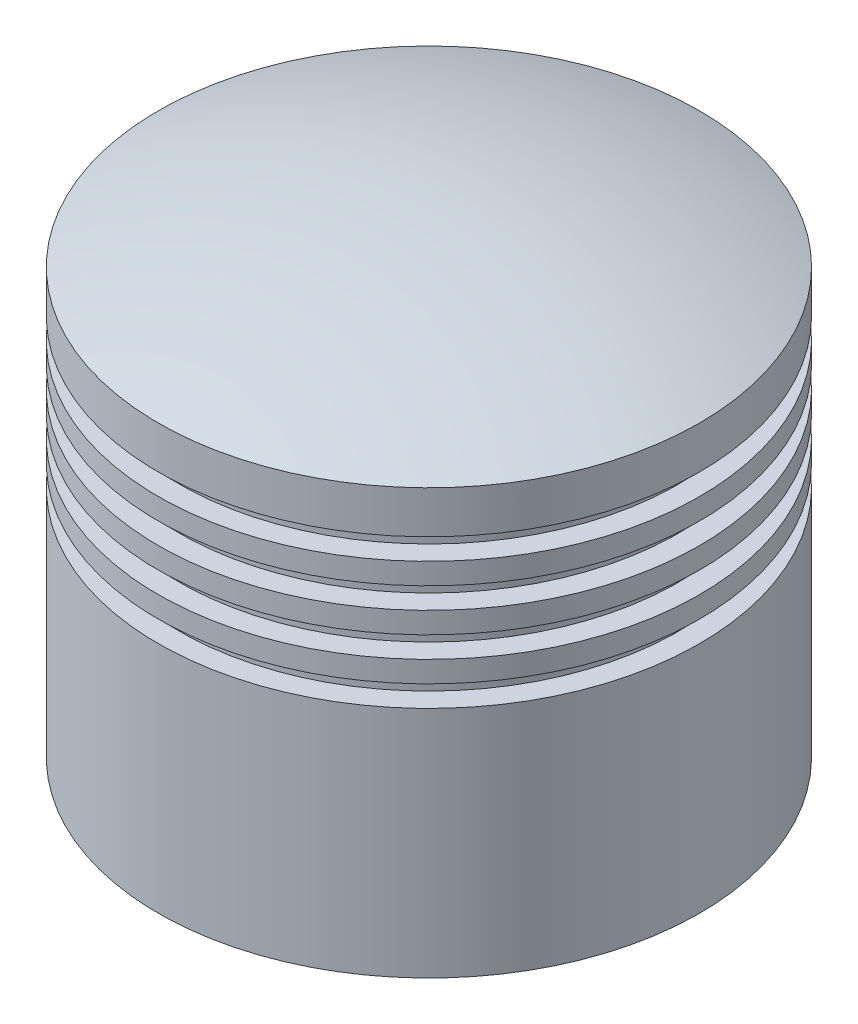
ISO-10303-21;
HEADER;
FILE_DESCRIPTION(('STEP AP214'),'2;1');
FILE_NAME('part.step','',(''),(''),'','','');
FILE_SCHEMA(('AUTOMOTIVE_DESIGN { 1 0 10303 214 1 1 1 1 }'));
ENDSEC;
DATA;
#1=APPLICATION_CONTEXT('core data for automotive mechanical design processes');
#2=APPLICATION_PROTOCOL_DEFINITION('international standard','automotive_design',2000,#1);
#3=PRODUCT_CONTEXT('',#1,'mechanical');
#4=PRODUCT('Part','Part','',(#3));
#5=PRODUCT_RELATED_PRODUCT_CATEGORY('part','',(#4));
#6=PRODUCT_DEFINITION_FORMATION('','',#4);
#7=PRODUCT_DEFINITION_CONTEXT('part definition',#1,'design');
#8=PRODUCT_DEFINITION('design','',#6,#7);
#9=PRODUCT_DEFINITION_SHAPE('','',#8);
#10=(LENGTH_UNIT() NAMED_UNIT(*) SI_UNIT(.MILLI.,.METRE.));
#11=(NAMED_UNIT(*) PLANE_ANGLE_UNIT() SI_UNIT($,.RADIAN.));
#12=(NAMED_UNIT(*) SI_UNIT($,.STERADIAN.) SOLID_ANGLE_UNIT());
#13=UNCERTAINTY_MEASURE_WITH_UNIT(LENGTH_MEASURE(1.E-05),#10,'distance_accuracy_value','');
#14=(GEOMETRIC_REPRESENTATION_CONTEXT(3) GLOBAL_UNCERTAINTY_ASSIGNED_CONTEXT((#13)) GLOBAL_UNIT_ASSIGNED_CONTEXT((#10,
#11,#12)) REPRESENTATION_CONTEXT('',''));
#15=CARTESIAN_POINT('',(0.,0.,0.));
#16=DIRECTION('',(0.,0.,1.));
#17=DIRECTION('',(1.,0.,0.));
#18=AXIS2_PLACEMENT_3D('',#15,#16,#17);
#19=CARTESIAN_POINT('',(63.7222756739561,0.,0.));
#20=DIRECTION('',(0.,-1.,0.));
#21=DIRECTION('',(0.,0.,-1.));
#22=AXIS2_PLACEMENT_3D('',#19,#20,#21);
#23=PLANE('',#22);
#24=CARTESIAN_POINT('',(0.,0.,0.));
#25=DIRECTION('',(0.,-1.,0.));
#26=DIRECTION('',(0.,0.,-1.));
#27=AXIS2_PLACEMENT_3D('',#24,#25,#26);
#28=CIRCLE('',#27,63.7222756739561);
#29=CARTESIAN_POINT('',(0.,0.,-63.7222756739561));
#30=VERTEX_POINT('',#29);
#31=EDGE_CURVE('E10',#30,#30,#28,.T.);
#32=ORIENTED_EDGE('',*,*,#31,.T.);
#33=EDGE_LOOP('',(#32));
#34=FACE_BOUND('',#33,.T.);
#35=CARTESIAN_POINT('',(0.,0.,0.));
#36=DIRECTION('',(0.,-1.,0.));
#37=DIRECTION('',(0.,0.,-1.));
#38=AXIS2_PLACEMENT_3D('',#35,#36,#37);
#39=CIRCLE('',#38,50.);
#40=CARTESIAN_POINT('',(0.,0.,-50.));
#41=VERTEX_POINT('',#40);
#42=EDGE_CURVE('E105',#41,#41,#39,.T.);
#43=ORIENTED_EDGE('',*,*,#42,.F.);
#44=EDGE_LOOP('',(#43));
#45=FACE_BOUND('',#44,.T.);
#46=ADVANCED_FACE('F35',(#34,#45),#23,.T.);
#47=CARTESIAN_POINT('',(0.,0.,0.));
#48=DIRECTION('',(0.,-1.,0.));
#49=DIRECTION('',(0.,0.,-1.));
#50=AXIS2_PLACEMENT_3D('',#47,#48,#49);
#51=CYLINDRICAL_SURFACE('',#50,63.7222756739561);
#52=CARTESIAN_POINT('',(0.,55.,0.));
#53=DIRECTION('',(0.,-1.,0.));
#54=DIRECTION('',(0.,0.,-1.));
#55=AXIS2_PLACEMENT_3D('',#52,#53,#54);
#56=CIRCLE('',#55,63.7222756739561);
#57=CARTESIAN_POINT('',(0.,55.,-63.7222756739561));
#58=VERTEX_POINT('',#57);
#59=EDGE_CURVE('E41',#58,#58,#56,.T.);
#60=ORIENTED_EDGE('',*,*,#59,.T.);
#61=EDGE_LOOP('',(#60));
#62=FACE_BOUND('',#61,.T.);
#63=ORIENTED_EDGE('',*,*,#31,.F.);
#64=EDGE_LOOP('',(#63));
#65=FACE_BOUND('',#64,.T.);
#66=ADVANCED_FACE('F113',(#62,#65),#51,.T.);
#67=CARTESIAN_POINT('',(63.7222756739561,55.,0.));
#68=DIRECTION('',(0.,1.,0.));
#69=DIRECTION('',(0.,0.,1.));
#70=AXIS2_PLACEMENT_3D('',#67,#68,#69);
#71=PLANE('',#70);
#72=CARTESIAN_POINT('',(0.,55.,0.));
#73=DIRECTION('',(0.,-1.,0.));
#74=DIRECTION('',(0.,0.,-1.));
#75=AXIS2_PLACEMENT_3D('',#72,#73,#74);
#76=CIRCLE('',#75,58.7222756739561);
#77=CARTESIAN_POINT('',(0.,55.,-58.7222756739561));
#78=VERTEX_POINT('',#77);
#79=EDGE_CURVE('E45',#78,#78,#76,.T.);
#80=ORIENTED_EDGE('',*,*,#79,.T.);
#81=EDGE_LOOP('',(#80));
#82=FACE_BOUND('',#81,.T.);
#83=ORIENTED_EDGE('',*,*,#59,.F.);
#84=EDGE_LOOP('',(#83));
#85=FACE_BOUND('',#84,.T.);
#86=ADVANCED_FACE('F117',(#82,#85),#71,.T.);
#87=CARTESIAN_POINT('',(0.,0.,0.));
#88=DIRECTION('',(0.,-1.,0.));
#89=DIRECTION('',(0.,0.,-1.));
#90=AXIS2_PLACEMENT_3D('',#87,#88,#89);
#91=CYLINDRICAL_SURFACE('',#90,58.7222756739561);
#92=CARTESIAN_POINT('',(0.,60.,0.));
#93=DIRECTION('',(0.,-1.,0.));
#94=DIRECTION('',(0.,0.,-1.));
#95=AXIS2_PLACEMENT_3D('',#92,#93,#94);
#96=CIRCLE('',#95,58.7222756739561);
#97=CARTESIAN_POINT('',(0.,60.,-58.7222756739561));
#98=VERTEX_POINT('',#97);
#99=EDGE_CURVE('E49',#98,#98,#96,.T.);
#100=ORIENTED_EDGE('',*,*,#99,.T.);
#101=EDGE_LOOP('',(#100));
#102=FACE_BOUND('',#101,.T.);
#103=ORIENTED_EDGE('',*,*,#79,.F.);
#104=EDGE_LOOP('',(#103));
#105=FACE_BOUND('',#104,.T.);
#106=ADVANCED_FACE('F121',(#102,#105),#91,.T.);
#107=CARTESIAN_POINT('',(58.7222756739561,60.,0.));
#108=DIRECTION('',(0.,-1.,0.));
#109=DIRECTION('',(0.,0.,-1.));
#110=AXIS2_PLACEMENT_3D('',#107,#108,#109);
#111=PLANE('',#110);
#112=CARTESIAN_POINT('',(0.,60.,0.));
#113=DIRECTION('',(0.,-1.,0.));
#114=DIRECTION('',(0.,0.,-1.));
#115=AXIS2_PLACEMENT_3D('',#112,#113,#114);
#116=CIRCLE('',#115,63.7222756739561);
#117=CARTESIAN_POINT('',(0.,60.,-63.7222756739561));
#118=VERTEX_POINT('',#117);
#119=EDGE_CURVE('E54',#118,#118,#116,.T.);
#120=ORIENTED_EDGE('',*,*,#119,.T.);
#121=EDGE_LOOP('',(#120));
#122=FACE_BOUND('',#121,.T.);
#123=ORIENTED_EDGE('',*,*,#99,.F.);
#124=EDGE_LOOP('',(#123));
#125=FACE_BOUND('',#124,.T.);
#126=ADVANCED_FACE('F128',(#122,#125),#111,.T.);
#127=CARTESIAN_POINT('',(0.,0.,0.));
#128=DIRECTION('',(0.,-1.,0.));
#129=DIRECTION('',(0.,0.,-1.));
#130=AXIS2_PLACEMENT_3D('',#127,#128,#129);
#131=CYLINDRICAL_SURFACE('',#130,63.7222756739561);
#132=CARTESIAN_POINT('',(0.,65.,0.));
#133=DIRECTION('',(0.,-1.,0.));
#134=DIRECTION('',(0.,0.,-1.));
#135=AXIS2_PLACEMENT_3D('',#132,#133,#134);
#136=CIRCLE('',#135,63.7222756739561);
#137=CARTESIAN_POINT('',(0.,65.,-63.7222756739561));
#138=VERTEX_POINT('',#137);
#139=EDGE_CURVE('E57',#138,#138,#136,.T.);
#140=ORIENTED_EDGE('',*,*,#139,.T.);
#141=EDGE_LOOP('',(#140));
#142=FACE_BOUND('',#141,.T.);
#143=ORIENTED_EDGE('',*,*,#119,.F.);
#144=EDGE_LOOP('',(#143));
#145=FACE_BOUND('',#144,.T.);
#146=ADVANCED_FACE('F132',(#142,#145),#131,.T.);
#147=CARTESIAN_POINT('',(63.7222756739561,65.,0.));
#148=DIRECTION('',(0.,1.,0.));
#149=DIRECTION('',(0.,0.,1.));
#150=AXIS2_PLACEMENT_3D('',#147,#148,#149);
#151=PLANE('',#150);
#152=CARTESIAN_POINT('',(0.,65.,0.));
#153=DIRECTION('',(0.,-1.,0.));
#154=DIRECTION('',(0.,0.,-1.));
#155=AXIS2_PLACEMENT_3D('',#152,#153,#154);
#156=CIRCLE('',#155,58.7222756739561);
#157=CARTESIAN_POINT('',(0.,65.,-58.7222756739561));
#158=VERTEX_POINT('',#157);
#159=EDGE_CURVE('E60',#158,#158,#156,.T.);
#160=ORIENTED_EDGE('',*,*,#159,.T.);
#161=EDGE_LOOP('',(#160));
#162=FACE_BOUND('',#161,.T.);
#163=ORIENTED_EDGE('',*,*,#139,.F.);
#164=EDGE_LOOP('',(#163));
#165=FACE_BOUND('',#164,.T.);
#166=ADVANCED_FACE('F136',(#162,#165),#151,.T.);
#167=CARTESIAN_POINT('',(0.,0.,0.));
#168=DIRECTION('',(0.,-1.,0.));
#169=DIRECTION('',(0.,0.,-1.));
#170=AXIS2_PLACEMENT_3D('',#167,#168,#169);
#171=CYLINDRICAL_SURFACE('',#170,58.7222756739561);
#172=CARTESIAN_POINT('',(0.,70.,0.));
#173=DIRECTION('',(0.,-1.,0.));
#174=DIRECTION('',(0.,0.,-1.));
#175=AXIS2_PLACEMENT_3D('',#172,#173,#174);
#176=CIRCLE('',#175,58.7222756739561);
#177=CARTESIAN_POINT('',(0.,70.,-58.7222756739561));
#178=VERTEX_POINT('',#177);
#179=EDGE_CURVE('E63',#178,#178,#176,.T.);
#180=ORIENTED_EDGE('',*,*,#179,.T.);
#181=EDGE_LOOP('',(#180));
#182=FACE_BOUND('',#181,.T.);
#183=ORIENTED_EDGE('',*,*,#159,.F.);
#184=EDGE_LOOP('',(#183));
#185=FACE_BOUND('',#184,.T.);
#186=ADVANCED_FACE('F140',(#182,#185),#171,.T.);
#187=CARTESIAN_POINT('',(58.7222756739561,70.,0.));
#188=DIRECTION('',(0.,-1.,0.));
#189=DIRECTION('',(0.,0.,-1.));
#190=AXIS2_PLACEMENT_3D('',#187,#188,#189);
#191=PLANE('',#190);
#192=CARTESIAN_POINT('',(0.,70.,0.));
#193=DIRECTION('',(0.,-1.,0.));
#194=DIRECTION('',(0.,0.,-1.));
#195=AXIS2_PLACEMENT_3D('',#192,#193,#194);
#196=CIRCLE('',#195,63.7222756739561);
#197=CARTESIAN_POINT('',(0.,70.,-63.7222756739561));
#198=VERTEX_POINT('',#197);
#199=EDGE_CURVE('E66',#198,#198,#196,.T.);
#200=ORIENTED_EDGE('',*,*,#199,.T.);
#201=EDGE_LOOP('',(#200));
#202=FACE_BOUND('',#201,.T.);
#203=ORIENTED_EDGE('',*,*,#179,.F.);
#204=EDGE_LOOP('',(#203));
#205=FACE_BOUND('',#204,.T.);
#206=ADVANCED_FACE('F144',(#202,#205),#191,.T.);
#207=CARTESIAN_POINT('',(0.,0.,0.));
#208=DIRECTION('',(0.,-1.,0.));
#209=DIRECTION('',(0.,0.,-1.));
#210=AXIS2_PLACEMENT_3D('',#207,#208,#209);
#211=CYLINDRICAL_SURFACE('',#210,63.7222756739561);
#212=CARTESIAN_POINT('',(0.,75.,0.));
#213=DIRECTION('',(0.,-1.,0.));
#214=DIRECTION('',(0.,0.,-1.));
#215=AXIS2_PLACEMENT_3D('',#212,#213,#214);
#216=CIRCLE('',#215,63.7222756739561);
#217=CARTESIAN_POINT('',(0.,75.,-63.7222756739561));
#218=VERTEX_POINT('',#217);
#219=EDGE_CURVE('E69',#218,#218,#216,.T.);
#220=ORIENTED_EDGE('',*,*,#219,.T.);
#221=EDGE_LOOP('',(#220));
#222=FACE_BOUND('',#221,.T.);
#223=ORIENTED_EDGE('',*,*,#199,.F.);
#224=EDGE_LOOP('',(#223));
#225=FACE_BOUND('',#224,.T.);
#226=ADVANCED_FACE('F148',(#222,#225),#211,.T.);
#227=CARTESIAN_POINT('',(63.7222756739561,75.,0.));
#228=DIRECTION('',(0.,1.,0.));
#229=DIRECTION('',(0.,0.,1.));
#230=AXIS2_PLACEMENT_3D('',#227,#228,#229);
#231=PLANE('',#230);
#232=CARTESIAN_POINT('',(0.,75.,0.));
#233=DIRECTION('',(0.,-1.,0.));
#234=DIRECTION('',(0.,0.,-1.));
#235=AXIS2_PLACEMENT_3D('',#232,#233,#234);
#236=CIRCLE('',#235,58.7222756739561);
#237=CARTESIAN_POINT('',(0.,75.,-58.7222756739561));
#238=VERTEX_POINT('',#237);
#239=EDGE_CURVE('E72',#238,#238,#236,.T.);
#240=ORIENTED_EDGE('',*,*,#239,.T.);
#241=EDGE_LOOP('',(#240));
#242=FACE_BOUND('',#241,.T.);
#243=ORIENTED_EDGE('',*,*,#219,.F.);
#244=EDGE_LOOP('',(#243));
#245=FACE_BOUND('',#244,.T.);
#246=ADVANCED_FACE('F152',(#242,#245),#231,.T.);
#247=CARTESIAN_POINT('',(0.,0.,0.));
#248=DIRECTION('',(0.,-1.,0.));
#249=DIRECTION('',(0.,0.,-1.));
#250=AXIS2_PLACEMENT_3D('',#247,#248,#249);
#251=CYLINDRICAL_SURFACE('',#250,58.7222756739561);
#252=CARTESIAN_POINT('',(0.,80.,0.));
#253=DIRECTION('',(0.,-1.,0.));
#254=DIRECTION('',(0.,0.,-1.));
#255=AXIS2_PLACEMENT_3D('',#252,#253,#254);
#256=CIRCLE('',#255,58.7222756739561);
#257=CARTESIAN_POINT('',(0.,80.,-58.7222756739561));
#258=VERTEX_POINT('',#257);
#259=EDGE_CURVE('E75',#258,#258,#256,.T.);
#260=ORIENTED_EDGE('',*,*,#259,.T.);
#261=EDGE_LOOP('',(#260));
#262=FACE_BOUND('',#261,.T.);
#263=ORIENTED_EDGE('',*,*,#239,.F.);
#264=EDGE_LOOP('',(#263));
#265=FACE_BOUND('',#264,.T.);
#266=ADVANCED_FACE('F156',(#262,#265),#251,.T.);
#267=CARTESIAN_POINT('',(58.7222756739561,80.,0.));
#268=DIRECTION('',(0.,-1.,0.));
#269=DIRECTION('',(0.,0.,-1.));
#270=AXIS2_PLACEMENT_3D('',#267,#268,#269);
#271=PLANE('',#270);
#272=CARTESIAN_POINT('',(0.,80.,0.));
#273=DIRECTION('',(0.,-1.,0.));
#274=DIRECTION('',(0.,0.,-1.));
#275=AXIS2_PLACEMENT_3D('',#272,#273,#274);
#276=CIRCLE('',#275,63.7222756739561);
#277=CARTESIAN_POINT('',(0.,80.,-63.7222756739561));
#278=VERTEX_POINT('',#277);
#279=EDGE_CURVE('E78',#278,#278,#276,.T.);
#280=ORIENTED_EDGE('',*,*,#279,.T.);
#281=EDGE_LOOP('',(#280));
#282=FACE_BOUND('',#281,.T.);
#283=ORIENTED_EDGE('',*,*,#259,.F.);
#284=EDGE_LOOP('',(#283));
#285=FACE_BOUND('',#284,.T.);
#286=ADVANCED_FACE('F160',(#282,#285),#271,.T.);
#287=CARTESIAN_POINT('',(0.,0.,0.));
#288=DIRECTION('',(0.,-1.,0.));
#289=DIRECTION('',(0.,0.,-1.));
#290=AXIS2_PLACEMENT_3D('',#287,#288,#289);
#291=CYLINDRICAL_SURFACE('',#290,63.7222756739561);
#292=CARTESIAN_POINT('',(0.,85.,0.));
#293=DIRECTION('',(0.,-1.,0.));
#294=DIRECTION('',(0.,0.,-1.));
#295=AXIS2_PLACEMENT_3D('',#292,#293,#294);
#296=CIRCLE('',#295,63.7222756739561);
#297=CARTESIAN_POINT('',(0.,85.,-63.7222756739561));
#298=VERTEX_POINT('',#297);
#299=EDGE_CURVE('E81',#298,#298,#296,.T.);
#300=ORIENTED_EDGE('',*,*,#299,.T.);
#301=EDGE_LOOP('',(#300));
#302=FACE_BOUND('',#301,.T.);
#303=ORIENTED_EDGE('',*,*,#279,.F.);
#304=EDGE_LOOP('',(#303));
#305=FACE_BOUND('',#304,.T.);
#306=ADVANCED_FACE('F164',(#302,#305),#291,.T.);
#307=CARTESIAN_POINT('',(63.7222756739561,85.,0.));
#308=DIRECTION('',(0.,1.,0.));
#309=DIRECTION('',(0.,0.,1.));
#310=AXIS2_PLACEMENT_3D('',#307,#308,#309);
#311=PLANE('',#310);
#312=CARTESIAN_POINT('',(0.,85.,0.));
#313=DIRECTION('',(0.,-1.,0.));
#314=DIRECTION('',(0.,0.,-1.));
#315=AXIS2_PLACEMENT_3D('',#312,#313,#314);
#316=CIRCLE('',#315,58.7222756739561);
#317=CARTESIAN_POINT('',(0.,85.,-58.7222756739561));
#318=VERTEX_POINT('',#317);
#319=EDGE_CURVE('E84',#318,#318,#316,.T.);
#320=ORIENTED_EDGE('',*,*,#319,.T.);
#321=EDGE_LOOP('',(#320));
#322=FACE_BOUND('',#321,.T.);
#323=ORIENTED_EDGE('',*,*,#299,.F.);
#324=EDGE_LOOP('',(#323));
#325=FACE_BOUND('',#324,.T.);
#326=ADVANCED_FACE('F168',(#322,#325),#311,.T.);
#327=CARTESIAN_POINT('',(0.,0.,0.));
#328=DIRECTION('',(0.,-1.,0.));
#329=DIRECTION('',(0.,0.,-1.));
#330=AXIS2_PLACEMENT_3D('',#327,#328,#329);
#331=CYLINDRICAL_SURFACE('',#330,58.7222756739561);
#332=CARTESIAN_POINT('',(0.,90.,0.));
#333=DIRECTION('',(0.,-1.,0.));
#334=DIRECTION('',(0.,0.,-1.));
#335=AXIS2_PLACEMENT_3D('',#332,#333,#334);
#336=CIRCLE('',#335,58.7222756739561);
#337=CARTESIAN_POINT('',(0.,90.,-58.7222756739561));
#338=VERTEX_POINT('',#337);
#339=EDGE_CURVE('E87',#338,#338,#336,.T.);
#340=ORIENTED_EDGE('',*,*,#339,.T.);
#341=EDGE_LOOP('',(#340));
#342=FACE_BOUND('',#341,.T.);
#343=ORIENTED_EDGE('',*,*,#319,.F.);
#344=EDGE_LOOP('',(#343));
#345=FACE_BOUND('',#344,.T.);
#346=ADVANCED_FACE('F172',(#342,#345),#331,.T.);
#347=CARTESIAN_POINT('',(58.7222756739561,90.,0.));
#348=DIRECTION('',(0.,-1.,0.));
#349=DIRECTION('',(0.,0.,-1.));
#350=AXIS2_PLACEMENT_3D('',#347,#348,#349);
#351=PLANE('',#350);
#352=CARTESIAN_POINT('',(0.,90.,0.));
#353=DIRECTION('',(0.,-1.,0.));
#354=DIRECTION('',(0.,0.,-1.));
#355=AXIS2_PLACEMENT_3D('',#352,#353,#354);
#356=CIRCLE('',#355,63.7222756739561);
#357=CARTESIAN_POINT('',(0.,90.,-63.7222756739561));
#358=VERTEX_POINT('',#357);
#359=EDGE_CURVE('E90',#358,#358,#356,.T.);
#360=ORIENTED_EDGE('',*,*,#359,.T.);
#361=EDGE_LOOP('',(#360));
#362=FACE_BOUND('',#361,.T.);
#363=ORIENTED_EDGE('',*,*,#339,.F.);
#364=EDGE_LOOP('',(#363));
#365=FACE_BOUND('',#364,.T.);
#366=ADVANCED_FACE('F176',(#362,#365),#351,.T.);
#367=CARTESIAN_POINT('',(0.,0.,0.));
#368=DIRECTION('',(0.,-1.,0.));
#369=DIRECTION('',(0.,0.,-1.));
#370=AXIS2_PLACEMENT_3D('',#367,#368,#369);
#371=CYLINDRICAL_SURFACE('',#370,63.7222756739561);
#372=CARTESIAN_POINT('',(0.,100.,0.));
#373=DIRECTION('',(0.,-1.,0.));
#374=DIRECTION('',(0.,0.,-1.));
#375=AXIS2_PLACEMENT_3D('',#372,#373,#374);
#376=CIRCLE('',#375,63.7222756739561);
#377=CARTESIAN_POINT('',(0.,100.,-63.7222756739561));
#378=VERTEX_POINT('',#377);
#379=EDGE_CURVE('E93',#378,#378,#376,.T.);
#380=ORIENTED_EDGE('',*,*,#379,.T.);
#381=EDGE_LOOP('',(#380));
#382=FACE_BOUND('',#381,.T.);
#383=ORIENTED_EDGE('',*,*,#359,.F.);
#384=EDGE_LOOP('',(#383));
#385=FACE_BOUND('',#384,.T.);
#386=ADVANCED_FACE('F180',(#382,#385),#371,.T.);
#387=CARTESIAN_POINT('',(0.,-57.6054300553517,0.));
#388=DIRECTION('',(0.,-1.,0.));
#389=DIRECTION('',(1.,0.,0.));
#390=AXIS2_PLACEMENT_3D('',#387,#388,#389);
#391=SPHERICAL_SURFACE('',#390,170.);
#392=ORIENTED_EDGE('',*,*,#379,.F.);
#393=EDGE_LOOP('',(#392));
#394=FACE_BOUND('',#393,.T.);
#395=ADVANCED_FACE('F184',(#394),#391,.T.);
#396=CARTESIAN_POINT('',(0.,-57.6054300553517,0.));
#397=DIRECTION('',(0.,-1.,0.));
#398=DIRECTION('',(1.,0.,0.));
#399=AXIS2_PLACEMENT_3D('',#396,#397,#398);
#400=SPHERICAL_SURFACE('',#399,163.);
#401=CARTESIAN_POINT('',(0.,99.6205220009167,0.));
#402=DIRECTION('',(0.,-1.,0.));
#403=DIRECTION('',(0.,0.,-1.));
#404=AXIS2_PLACEMENT_3D('',#401,#402,#403);
#405=CIRCLE('',#404,43.);
#406=CARTESIAN_POINT('',(0.,99.6205220009167,-43.));
#407=VERTEX_POINT('',#406);
#408=EDGE_CURVE('E96',#407,#407,#405,.T.);
#409=ORIENTED_EDGE('',*,*,#408,.T.);
#410=EDGE_LOOP('',(#409));
#411=FACE_BOUND('',#410,.T.);
#412=ADVANCED_FACE('F188',(#411),#400,.F.);
#413=CARTESIAN_POINT('',(0.,0.,0.));
#414=DIRECTION('',(0.,-1.,0.));
#415=DIRECTION('',(0.,0.,-1.));
#416=AXIS2_PLACEMENT_3D('',#413,#414,#415);
#417=CYLINDRICAL_SURFACE('',#416,43.);
#418=CARTESIAN_POINT('',(0.,30.,0.));
#419=DIRECTION('',(0.,-1.,0.));
#420=DIRECTION('',(0.,0.,-1.));
#421=AXIS2_PLACEMENT_3D('',#418,#419,#420);
#422=CIRCLE('',#421,43.);
#423=CARTESIAN_POINT('',(0.,30.,-43.));
#424=VERTEX_POINT('',#423);
#425=EDGE_CURVE('E99',#424,#424,#422,.T.);
#426=ORIENTED_EDGE('',*,*,#425,.T.);
#427=EDGE_LOOP('',(#426));
#428=FACE_BOUND('',#427,.T.);
#429=ORIENTED_EDGE('',*,*,#408,.F.);
#430=EDGE_LOOP('',(#429));
#431=FACE_BOUND('',#430,.T.);
#432=ADVANCED_FACE('F192',(#428,#431),#417,.F.);
#433=CARTESIAN_POINT('',(50.,30.,0.));
#434=DIRECTION('',(0.,-1.,0.));
#435=DIRECTION('',(0.,0.,-1.));
#436=AXIS2_PLACEMENT_3D('',#433,#434,#435);
#437=PLANE('',#436);
#438=CARTESIAN_POINT('',(0.,30.,0.));
#439=DIRECTION('',(0.,-1.,0.));
#440=DIRECTION('',(0.,0.,-1.));
#441=AXIS2_PLACEMENT_3D('',#438,#439,#440);
#442=CIRCLE('',#441,50.);
#443=CARTESIAN_POINT('',(0.,30.,-50.));
#444=VERTEX_POINT('',#443);
#445=EDGE_CURVE('E102',#444,#444,#442,.T.);
#446=ORIENTED_EDGE('',*,*,#445,.T.);
#447=EDGE_LOOP('',(#446));
#448=FACE_BOUND('',#447,.T.);
#449=ORIENTED_EDGE('',*,*,#425,.F.);
#450=EDGE_LOOP('',(#449));
#451=FACE_BOUND('',#450,.T.);
#452=ADVANCED_FACE('F196',(#448,#451),#437,.T.);
#453=CARTESIAN_POINT('',(0.,0.,0.));
#454=DIRECTION('',(0.,-1.,0.));
#455=DIRECTION('',(0.,0.,-1.));
#456=AXIS2_PLACEMENT_3D('',#453,#454,#455);
#457=CYLINDRICAL_SURFACE('',#456,50.);
#458=ORIENTED_EDGE('',*,*,#42,.T.);
#459=EDGE_LOOP('',(#458));
#460=FACE_BOUND('',#459,.T.);
#461=ORIENTED_EDGE('',*,*,#445,.F.);
#462=EDGE_LOOP('',(#461));
#463=FACE_BOUND('',#462,.T.);
#464=ADVANCED_FACE('F109',(#460,#463),#457,.F.);
#465=CLOSED_SHELL('',(#46,#66,#86,#106,#126,#146,#166,#186,#206,#226,#246,#266,#286,#306,#326,
#346,#366,#386,#395,#412,#432,#452,#464));
#466=MANIFOLD_SOLID_BREP('B2',#465);
#467=ADVANCED_BREP_SHAPE_REPRESENTATION('',(#18,#466),#14);
#468=SHAPE_DEFINITION_REPRESENTATION(#9,#467);
ENDSEC;
END-ISO-10303-21;
